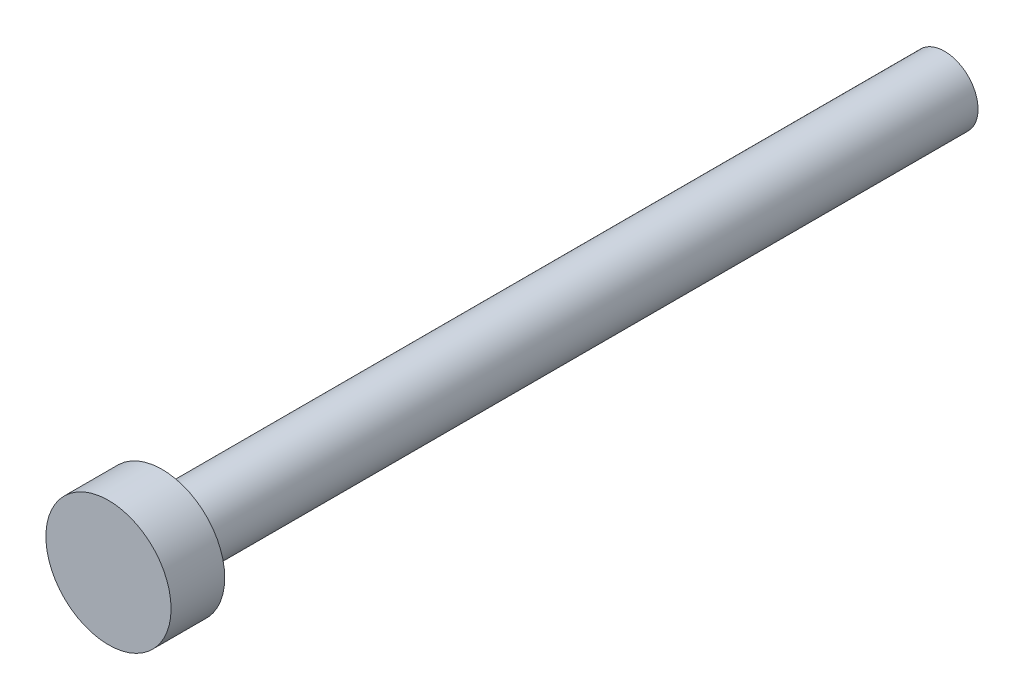
ISO-10303-21;
HEADER;
FILE_DESCRIPTION(('STEP AP214'),'2;1');
FILE_NAME('part.step','',(''),(''),'','','');
FILE_SCHEMA(('AUTOMOTIVE_DESIGN { 1 0 10303 214 1 1 1 1 }'));
ENDSEC;
DATA;
#1=APPLICATION_CONTEXT('core data for automotive mechanical design processes');
#2=APPLICATION_PROTOCOL_DEFINITION('international standard','automotive_design',2000,#1);
#3=PRODUCT_CONTEXT('',#1,'mechanical');
#4=PRODUCT('Part','Part','',(#3));
#5=PRODUCT_RELATED_PRODUCT_CATEGORY('part','',(#4));
#6=PRODUCT_DEFINITION_FORMATION('','',#4);
#7=PRODUCT_DEFINITION_CONTEXT('part definition',#1,'design');
#8=PRODUCT_DEFINITION('design','',#6,#7);
#9=PRODUCT_DEFINITION_SHAPE('','',#8);
#10=(LENGTH_UNIT() NAMED_UNIT(*) SI_UNIT(.MILLI.,.METRE.));
#11=(NAMED_UNIT(*) PLANE_ANGLE_UNIT() SI_UNIT($,.RADIAN.));
#12=(NAMED_UNIT(*) SI_UNIT($,.STERADIAN.) SOLID_ANGLE_UNIT());
#13=UNCERTAINTY_MEASURE_WITH_UNIT(LENGTH_MEASURE(1.E-05),#10,'distance_accuracy_value','');
#14=(GEOMETRIC_REPRESENTATION_CONTEXT(3) GLOBAL_UNCERTAINTY_ASSIGNED_CONTEXT((#13)) GLOBAL_UNIT_ASSIGNED_CONTEXT((#10,
#11,#12)) REPRESENTATION_CONTEXT('',''));
#15=CARTESIAN_POINT('',(0.,0.,0.));
#16=DIRECTION('',(0.,0.,1.));
#17=DIRECTION('',(1.,0.,0.));
#18=AXIS2_PLACEMENT_3D('',#15,#16,#17);
#19=CARTESIAN_POINT('',(0.,0.,2.4));
#20=DIRECTION('',(0.,0.,-1.));
#21=DIRECTION('',(-1.,0.,0.));
#22=AXIS2_PLACEMENT_3D('',#19,#20,#21);
#23=CYLINDRICAL_SURFACE('',#22,2.8);
#24=CARTESIAN_POINT('',(0.,0.,2.4));
#25=DIRECTION('',(0.,0.,1.));
#26=DIRECTION('',(1.,0.,0.));
#27=AXIS2_PLACEMENT_3D('',#24,#25,#26);
#28=CIRCLE('',#27,2.8);
#29=CARTESIAN_POINT('',(2.8,0.,2.4));
#30=VERTEX_POINT('',#29);
#31=EDGE_CURVE('E37',#30,#30,#28,.T.);
#32=ORIENTED_EDGE('',*,*,#31,.F.);
#33=EDGE_LOOP('',(#32));
#34=FACE_BOUND('',#33,.T.);
#35=CARTESIAN_POINT('',(0.,0.,0.));
#36=DIRECTION('',(0.,0.,1.));
#37=DIRECTION('',(1.,0.,0.));
#38=AXIS2_PLACEMENT_3D('',#35,#36,#37);
#39=CIRCLE('',#38,2.8);
#40=CARTESIAN_POINT('',(2.8,0.,0.));
#41=VERTEX_POINT('',#40);
#42=EDGE_CURVE('E33',#41,#41,#39,.T.);
#43=ORIENTED_EDGE('',*,*,#42,.T.);
#44=EDGE_LOOP('',(#43));
#45=FACE_BOUND('',#44,.T.);
#46=ADVANCED_FACE('F30',(#34,#45),#23,.T.);
#47=CARTESIAN_POINT('',(0.,0.,2.4));
#48=DIRECTION('',(0.,0.,1.));
#49=DIRECTION('',(1.,0.,0.));
#50=AXIS2_PLACEMENT_3D('',#47,#48,#49);
#51=PLANE('',#50);
#52=ORIENTED_EDGE('',*,*,#31,.T.);
#53=EDGE_LOOP('',(#52));
#54=FACE_BOUND('',#53,.T.);
#55=ADVANCED_FACE('F54',(#54),#51,.T.);
#56=CARTESIAN_POINT('',(0.,0.,0.));
#57=DIRECTION('',(0.,0.,1.));
#58=DIRECTION('',(1.,0.,0.));
#59=AXIS2_PLACEMENT_3D('',#56,#57,#58);
#60=PLANE('',#59);
#61=CARTESIAN_POINT('',(0.,0.,0.));
#62=DIRECTION('',(0.,0.,-1.));
#63=DIRECTION('',(-1.,0.,0.));
#64=AXIS2_PLACEMENT_3D('',#61,#62,#63);
#65=CIRCLE('',#64,1.5);
#66=CARTESIAN_POINT('',(-1.5,0.,0.));
#67=VERTEX_POINT('',#66);
#68=EDGE_CURVE('E10',#67,#67,#65,.T.);
#69=ORIENTED_EDGE('',*,*,#68,.F.);
#70=EDGE_LOOP('',(#69));
#71=FACE_BOUND('',#70,.T.);
#72=ORIENTED_EDGE('',*,*,#42,.F.);
#73=EDGE_LOOP('',(#72));
#74=FACE_BOUND('',#73,.T.);
#75=ADVANCED_FACE('F51',(#71,#74),#60,.F.);
#76=CARTESIAN_POINT('',(0.,0.,-35.));
#77=DIRECTION('',(0.,0.,1.));
#78=DIRECTION('',(1.,0.,0.));
#79=AXIS2_PLACEMENT_3D('',#76,#77,#78);
#80=CYLINDRICAL_SURFACE('',#79,1.5);
#81=CARTESIAN_POINT('',(0.,0.,-35.));
#82=DIRECTION('',(0.,0.,-1.));
#83=DIRECTION('',(-1.,0.,0.));
#84=AXIS2_PLACEMENT_3D('',#81,#82,#83);
#85=CIRCLE('',#84,1.5);
#86=CARTESIAN_POINT('',(-1.5,0.,-35.));
#87=VERTEX_POINT('',#86);
#88=EDGE_CURVE('E43',#87,#87,#85,.T.);
#89=ORIENTED_EDGE('',*,*,#88,.F.);
#90=EDGE_LOOP('',(#89));
#91=FACE_BOUND('',#90,.T.);
#92=ORIENTED_EDGE('',*,*,#68,.T.);
#93=EDGE_LOOP('',(#92));
#94=FACE_BOUND('',#93,.T.);
#95=ADVANCED_FACE('F53',(#91,#94),#80,.T.);
#96=CARTESIAN_POINT('',(0.,0.,-35.));
#97=DIRECTION('',(0.,0.,-1.));
#98=DIRECTION('',(-1.,0.,0.));
#99=AXIS2_PLACEMENT_3D('',#96,#97,#98);
#100=PLANE('',#99);
#101=ORIENTED_EDGE('',*,*,#88,.T.);
#102=EDGE_LOOP('',(#101));
#103=FACE_BOUND('',#102,.T.);
#104=ADVANCED_FACE('F60',(#103),#100,.T.);
#105=CLOSED_SHELL('',(#46,#55,#75,#95,#104));
#106=MANIFOLD_SOLID_BREP('B2',#105);
#107=ADVANCED_BREP_SHAPE_REPRESENTATION('',(#18,#106),#14);
#108=SHAPE_DEFINITION_REPRESENTATION(#9,#107);
ENDSEC;
END-ISO-10303-21;
